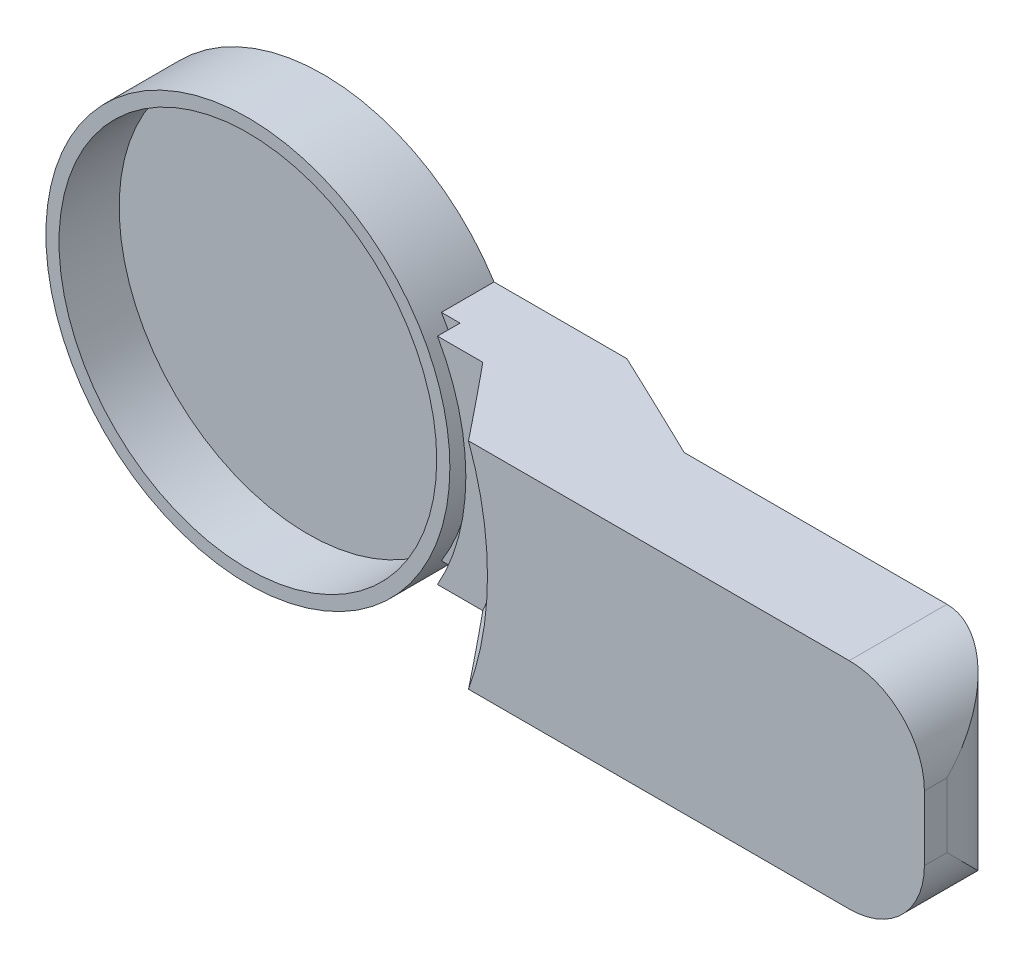
ISO-10303-21;
HEADER;
FILE_DESCRIPTION(('STEP AP214'),'2;1');
FILE_NAME('part.step','',(''),(''),'','','');
FILE_SCHEMA(('AUTOMOTIVE_DESIGN { 1 0 10303 214 1 1 1 1 }'));
ENDSEC;
DATA;
#1=APPLICATION_CONTEXT('core data for automotive mechanical design processes');
#2=APPLICATION_PROTOCOL_DEFINITION('international standard','automotive_design',2000,#1);
#3=PRODUCT_CONTEXT('',#1,'mechanical');
#4=PRODUCT('Part','Part','',(#3));
#5=PRODUCT_RELATED_PRODUCT_CATEGORY('part','',(#4));
#6=PRODUCT_DEFINITION_FORMATION('','',#4);
#7=PRODUCT_DEFINITION_CONTEXT('part definition',#1,'design');
#8=PRODUCT_DEFINITION('design','',#6,#7);
#9=PRODUCT_DEFINITION_SHAPE('','',#8);
#10=(LENGTH_UNIT() NAMED_UNIT(*) SI_UNIT(.MILLI.,.METRE.));
#11=(NAMED_UNIT(*) PLANE_ANGLE_UNIT() SI_UNIT($,.RADIAN.));
#12=(NAMED_UNIT(*) SI_UNIT($,.STERADIAN.) SOLID_ANGLE_UNIT());
#13=UNCERTAINTY_MEASURE_WITH_UNIT(LENGTH_MEASURE(1.E-05),#10,'distance_accuracy_value','');
#14=(GEOMETRIC_REPRESENTATION_CONTEXT(3) GLOBAL_UNCERTAINTY_ASSIGNED_CONTEXT((#13)) GLOBAL_UNIT_ASSIGNED_CONTEXT((#10,
#11,#12)) REPRESENTATION_CONTEXT('',''));
#15=CARTESIAN_POINT('',(0.,0.,0.));
#16=DIRECTION('',(0.,0.,1.));
#17=DIRECTION('',(1.,0.,0.));
#18=AXIS2_PLACEMENT_3D('',#15,#16,#17);
#19=CARTESIAN_POINT('',(0.,0.,10.));
#20=DIRECTION('',(0.,0.,1.));
#21=DIRECTION('',(1.,0.,0.));
#22=AXIS2_PLACEMENT_3D('',#19,#20,#21);
#23=PLANE('',#22);
#24=CARTESIAN_POINT('',(0.,0.,10.));
#25=DIRECTION('',(0.,0.,1.));
#26=DIRECTION('',(1.,0.,0.));
#27=AXIS2_PLACEMENT_3D('',#24,#25,#26);
#28=CIRCLE('',#27,25.125);
#29=CARTESIAN_POINT('',(25.125,0.,10.));
#30=VERTEX_POINT('',#29);
#31=EDGE_CURVE('E319',#30,#30,#28,.T.);
#32=ORIENTED_EDGE('',*,*,#31,.F.);
#33=EDGE_LOOP('',(#32));
#34=FACE_BOUND('',#33,.T.);
#35=CARTESIAN_POINT('',(0.,0.,10.));
#36=DIRECTION('',(0.,0.,1.));
#37=DIRECTION('',(1.,0.,0.));
#38=AXIS2_PLACEMENT_3D('',#35,#36,#37);
#39=CIRCLE('',#38,26.875);
#40=CARTESIAN_POINT('',(26.875,0.,10.));
#41=VERTEX_POINT('',#40);
#42=EDGE_CURVE('E263',#41,#41,#39,.T.);
#43=ORIENTED_EDGE('',*,*,#42,.T.);
#44=EDGE_LOOP('',(#43));
#45=FACE_BOUND('',#44,.T.);
#46=ADVANCED_FACE('F40',(#34,#45),#23,.T.);
#47=CARTESIAN_POINT('',(0.,0.,2.));
#48=DIRECTION('',(0.,0.,-1.));
#49=DIRECTION('',(-1.,0.,0.));
#50=AXIS2_PLACEMENT_3D('',#47,#48,#49);
#51=CYLINDRICAL_SURFACE('',#50,26.875);
#52=CARTESIAN_POINT('',(0.,0.,7.));
#53=DIRECTION('',(0.,0.,1.));
#54=DIRECTION('',(1.,0.,0.));
#55=AXIS2_PLACEMENT_3D('',#52,#53,#54);
#56=CIRCLE('',#55,26.875);
#57=CARTESIAN_POINT('',(22.7484191830579,-14.3099633008573,7.));
#58=VERTEX_POINT('',#57);
#59=CARTESIAN_POINT('',(22.7484191830579,14.3099633008573,7.));
#60=VERTEX_POINT('',#59);
#61=EDGE_CURVE('E143',#58,#60,#56,.T.);
#62=ORIENTED_EDGE('',*,*,#61,.T.);
#63=DIRECTION('',(0.,0.,1.));
#64=VECTOR('',#63,1.);
#65=CARTESIAN_POINT('',(22.7484191830579,14.3099633008573,7.));
#66=LINE('',#65,#64);
#67=CARTESIAN_POINT('',(22.7484191830579,14.3099633008573,0.));
#68=VERTEX_POINT('',#67);
#69=EDGE_CURVE('E314',#68,#60,#66,.T.);
#70=ORIENTED_EDGE('',*,*,#69,.F.);
#71=CARTESIAN_POINT('',(0.,0.,0.));
#72=DIRECTION('',(0.,0.,1.));
#73=DIRECTION('',(1.,0.,0.));
#74=AXIS2_PLACEMENT_3D('',#71,#72,#73);
#75=CIRCLE('',#74,26.875);
#76=CARTESIAN_POINT('',(22.7484191830579,-14.3099633008573,0.));
#77=VERTEX_POINT('',#76);
#78=EDGE_CURVE('E257',#68,#77,#75,.T.);
#79=ORIENTED_EDGE('',*,*,#78,.T.);
#80=DIRECTION('',(0.,0.,1.));
#81=VECTOR('',#80,1.);
#82=CARTESIAN_POINT('',(22.7484191830579,-14.3099633008573,7.));
#83=LINE('',#82,#81);
#84=EDGE_CURVE('E316',#77,#58,#83,.T.);
#85=ORIENTED_EDGE('',*,*,#84,.T.);
#86=EDGE_LOOP('',(#62,#70,#79,#85));
#87=FACE_BOUND('',#86,.T.);
#88=ORIENTED_EDGE('',*,*,#42,.F.);
#89=EDGE_LOOP('',(#88));
#90=FACE_BOUND('',#89,.T.);
#91=ADVANCED_FACE('F220',(#87,#90),#51,.T.);
#92=CARTESIAN_POINT('',(0.,0.,0.));
#93=DIRECTION('',(0.,0.,1.));
#94=DIRECTION('',(1.,0.,0.));
#95=AXIS2_PLACEMENT_3D('',#92,#93,#94);
#96=PLANE('',#95);
#97=ORIENTED_EDGE('',*,*,#78,.F.);
#98=DIRECTION('',(1.,0.,0.));
#99=VECTOR('',#98,1.);
#100=CARTESIAN_POINT('',(100.,14.3099633008573,0.));
#101=LINE('',#100,#99);
#102=CARTESIAN_POINT('',(40.4164641616277,14.3099633008573,0.));
#103=VERTEX_POINT('',#102);
#104=EDGE_CURVE('E331',#68,#103,#101,.T.);
#105=ORIENTED_EDGE('',*,*,#104,.T.);
#106=CARTESIAN_POINT('',(0.,0.,0.));
#107=DIRECTION('',(0.,0.,1.));
#108=DIRECTION('',(1.,0.,0.));
#109=AXIS2_PLACEMENT_3D('',#106,#107,#108);
#110=CIRCLE('',#109,42.8750000000002);
#111=CARTESIAN_POINT('',(40.4164641616277,-14.3099633008573,0.));
#112=VERTEX_POINT('',#111);
#113=EDGE_CURVE('E174',#103,#112,#110,.F.);
#114=ORIENTED_EDGE('',*,*,#113,.T.);
#115=DIRECTION('',(-1.,0.,0.));
#116=VECTOR('',#115,1.);
#117=CARTESIAN_POINT('',(0.,-14.3099633008573,0.));
#118=LINE('',#117,#116);
#119=EDGE_CURVE('E327',#77,#112,#118,.F.);
#120=ORIENTED_EDGE('',*,*,#119,.F.);
#121=EDGE_LOOP('',(#97,#105,#114,#120));
#122=FACE_BOUND('',#121,.T.);
#123=ADVANCED_FACE('F226',(#122),#96,.F.);
#124=CARTESIAN_POINT('',(0.,0.,10.));
#125=DIRECTION('',(0.,0.,1.));
#126=DIRECTION('',(1.,0.,0.));
#127=AXIS2_PLACEMENT_3D('',#124,#125,#126);
#128=CIRCLE('',#127,29.);
#129=CARTESIAN_POINT('',(25.2234999619029,-14.3099633008573,10.));
#130=VERTEX_POINT('',#129);
#131=CARTESIAN_POINT('',(25.2234999619029,14.3099633008573,10.));
#132=VERTEX_POINT('',#131);
#133=EDGE_CURVE('E132',#130,#132,#128,.T.);
#134=ORIENTED_EDGE('',*,*,#133,.F.);
#135=DIRECTION('',(-1.,0.,0.));
#136=VECTOR('',#135,1.);
#137=CARTESIAN_POINT('',(0.,-14.3099633008573,10.));
#138=LINE('',#137,#136);
#139=CARTESIAN_POINT('',(31.2548488290717,-14.3099633008573,10.));
#140=VERTEX_POINT('',#139);
#141=EDGE_CURVE('E162',#140,#130,#138,.T.);
#142=ORIENTED_EDGE('',*,*,#141,.F.);
#143=CARTESIAN_POINT('',(0.,0.,10.));
#144=DIRECTION('',(0.,0.,1.));
#145=DIRECTION('',(1.,0.,0.));
#146=AXIS2_PLACEMENT_3D('',#143,#144,#145);
#147=CIRCLE('',#146,34.3750000000001);
#148=CARTESIAN_POINT('',(31.2548488290717,14.3099633008573,10.));
#149=VERTEX_POINT('',#148);
#150=EDGE_CURVE('E156',#140,#149,#147,.T.);
#151=ORIENTED_EDGE('',*,*,#150,.T.);
#152=DIRECTION('',(1.,0.,0.));
#153=VECTOR('',#152,1.);
#154=CARTESIAN_POINT('',(100.,14.3099633008573,10.));
#155=LINE('',#154,#153);
#156=EDGE_CURVE('E148',#132,#149,#155,.T.);
#157=ORIENTED_EDGE('',*,*,#156,.F.);
#158=EDGE_LOOP('',(#134,#142,#151,#157));
#159=FACE_BOUND('',#158,.T.);
#160=ADVANCED_FACE('F154',(#159),#23,.T.);
#161=CARTESIAN_POINT('',(0.,0.,10.));
#162=DIRECTION('',(0.,0.,-1.));
#163=DIRECTION('',(-1.,0.,0.));
#164=AXIS2_PLACEMENT_3D('',#161,#162,#163);
#165=CYLINDRICAL_SURFACE('',#164,25.125);
#166=ORIENTED_EDGE('',*,*,#31,.T.);
#167=EDGE_LOOP('',(#166));
#168=FACE_BOUND('',#167,.T.);
#169=CARTESIAN_POINT('',(0.,0.,2.));
#170=DIRECTION('',(0.,0.,1.));
#171=DIRECTION('',(1.,0.,0.));
#172=AXIS2_PLACEMENT_3D('',#169,#170,#171);
#173=CIRCLE('',#172,25.125);
#174=CARTESIAN_POINT('',(25.125,0.,2.));
#175=VERTEX_POINT('',#174);
#176=EDGE_CURVE('E254',#175,#175,#173,.F.);
#177=ORIENTED_EDGE('',*,*,#176,.T.);
#178=EDGE_LOOP('',(#177));
#179=FACE_BOUND('',#178,.T.);
#180=ADVANCED_FACE('F233',(#168,#179),#165,.F.);
#181=CARTESIAN_POINT('',(0.,0.,2.));
#182=DIRECTION('',(0.,0.,1.));
#183=DIRECTION('',(1.,0.,0.));
#184=AXIS2_PLACEMENT_3D('',#181,#182,#183);
#185=PLANE('',#184);
#186=ORIENTED_EDGE('',*,*,#176,.F.);
#187=EDGE_LOOP('',(#186));
#188=FACE_BOUND('',#187,.T.);
#189=ADVANCED_FACE('F238',(#188),#185,.T.);
#190=CARTESIAN_POINT('',(100.,14.3099633008573,7.));
#191=DIRECTION('',(-1.,0.,0.));
#192=DIRECTION('',(0.,0.,1.));
#193=AXIS2_PLACEMENT_3D('',#190,#191,#192);
#194=PLANE('',#193);
#195=DIRECTION('',(0.,-1.,0.));
#196=VECTOR('',#195,1.);
#197=CARTESIAN_POINT('',(100.,14.3099633008573,20.));
#198=LINE('',#197,#196);
#199=CARTESIAN_POINT('',(100.,4.30996330085727,20.));
#200=VERTEX_POINT('',#199);
#201=CARTESIAN_POINT('',(100.,-4.30996330085727,20.));
#202=VERTEX_POINT('',#201);
#203=EDGE_CURVE('E304',#200,#202,#198,.T.);
#204=ORIENTED_EDGE('',*,*,#203,.T.);
#205=DIRECTION('',(0.,0.,1.));
#206=VECTOR('',#205,1.);
#207=CARTESIAN_POINT('',(100.,-4.30996330085727,7.));
#208=LINE('',#207,#206);
#209=CARTESIAN_POINT('',(100.,-4.30996330085727,17.));
#210=VERTEX_POINT('',#209);
#211=EDGE_CURVE('E298',#202,#210,#208,.F.);
#212=ORIENTED_EDGE('',*,*,#211,.T.);
#213=DIRECTION('',(0.,-1.,0.));
#214=VECTOR('',#213,1.);
#215=CARTESIAN_POINT('',(100.,14.3099633008573,17.));
#216=LINE('',#215,#214);
#217=CARTESIAN_POINT('',(100.,4.30996330085727,17.));
#218=VERTEX_POINT('',#217);
#219=EDGE_CURVE('E293',#210,#218,#216,.F.);
#220=ORIENTED_EDGE('',*,*,#219,.T.);
#221=DIRECTION('',(0.,0.,1.));
#222=VECTOR('',#221,1.);
#223=CARTESIAN_POINT('',(100.,4.30996330085727,20.));
#224=LINE('',#223,#222);
#225=EDGE_CURVE('E286',#218,#200,#224,.T.);
#226=ORIENTED_EDGE('',*,*,#225,.T.);
#227=EDGE_LOOP('',(#204,#212,#220,#226));
#228=FACE_BOUND('',#227,.T.);
#229=ADVANCED_FACE('F246',(#228),#194,.F.);
#230=CARTESIAN_POINT('',(100.,-14.3099633008573,7.));
#231=DIRECTION('',(0.,1.,0.));
#232=DIRECTION('',(-1.,0.,0.));
#233=AXIS2_PLACEMENT_3D('',#230,#231,#232);
#234=PLANE('',#233);
#235=DIRECTION('',(-1.,0.,0.));
#236=VECTOR('',#235,1.);
#237=CARTESIAN_POINT('',(100.,-14.3099633008573,7.));
#238=LINE('',#237,#236);
#239=CARTESIAN_POINT('',(90.,-14.3099633008573,7.));
#240=VERTEX_POINT('',#239);
#241=CARTESIAN_POINT('',(55.0453501699111,-14.3099633008573,7.));
#242=VERTEX_POINT('',#241);
#243=EDGE_CURVE('E280',#240,#242,#238,.T.);
#244=ORIENTED_EDGE('',*,*,#243,.F.);
#245=DIRECTION('',(0.,0.,1.));
#246=VECTOR('',#245,1.);
#247=CARTESIAN_POINT('',(90.,-14.3099633008573,7.));
#248=LINE('',#247,#246);
#249=CARTESIAN_POINT('',(90.,-14.3099633008573,20.));
#250=VERTEX_POINT('',#249);
#251=EDGE_CURVE('E65',#240,#250,#248,.T.);
#252=ORIENTED_EDGE('',*,*,#251,.T.);
#253=DIRECTION('',(-1.,0.,0.));
#254=VECTOR('',#253,1.);
#255=CARTESIAN_POINT('',(100.,-14.3099633008573,20.));
#256=LINE('',#255,#254);
#257=CARTESIAN_POINT('',(39.3540414103574,-14.3099633008573,20.));
#258=VERTEX_POINT('',#257);
#259=EDGE_CURVE('E274',#250,#258,#256,.T.);
#260=ORIENTED_EDGE('',*,*,#259,.T.);
#261=CARTESIAN_POINT('',(39.3540414103574,-14.3099633008573,20.));
#262=CARTESIAN_POINT('',(38.918200396022,-14.3099633008573,19.4538669715759));
#263=CARTESIAN_POINT('',(38.4818466587863,-14.3099633008573,18.9081430980953));
#264=CARTESIAN_POINT('',(37.6080013020913,-14.3099633008573,17.8176062175523));
#265=CARTESIAN_POINT('',(37.1705096813851,-14.3099633008573,17.2727932114891));
#266=CARTESIAN_POINT('',(35.8561915050751,-14.3099633008573,15.6398993044532));
#267=CARTESIAN_POINT('',(34.9774910794101,-14.3099633008573,14.553325193687));
#268=CARTESIAN_POINT('',(33.2139466652834,-14.3099633008573,12.3851455345182));
#269=CARTESIAN_POINT('',(32.3291025995349,-14.3099633008573,11.3035400489064));
#270=CARTESIAN_POINT('',(30.9960731395238,-14.3099633008573,9.68585046843278));
#271=CARTESIAN_POINT('',(30.5507617427346,-14.3099633008573,9.14739785954175));
#272=CARTESIAN_POINT('',(29.6579675153371,-14.3099633008573,8.07229265777268));
#273=CARTESIAN_POINT('',(29.2104846763867,-14.3099633008573,7.53564007182324));
#274=CARTESIAN_POINT('',(28.7617901968588,-14.3099633008573,7.));
#275=B_SPLINE_CURVE_WITH_KNOTS('',3,(#261,#262,#263,#264,#265,#266,#267,#268,#269,#270,#271,
#272,#273,#274),.UNSPECIFIED.,.F.,.F.,(4,2,2,2,2,2,4),(0.,2.09617895840916,4.19236021476433,
8.38457569338143,12.5768440058506,14.6730500323726,16.7692641183333),.UNSPECIFIED.);
#276=EDGE_CURVE('E260',#258,#140,#275,.T.);
#277=ORIENTED_EDGE('',*,*,#276,.T.);
#278=ORIENTED_EDGE('',*,*,#141,.T.);
#279=DIRECTION('',(0.,0.,1.));
#280=VECTOR('',#279,1.);
#281=CARTESIAN_POINT('',(25.2234999619029,-14.3099633008573,7.));
#282=LINE('',#281,#280);
#283=CARTESIAN_POINT('',(25.2234999619029,-14.3099633008573,7.));
#284=VERTEX_POINT('',#283);
#285=EDGE_CURVE('E139',#130,#284,#282,.F.);
#286=ORIENTED_EDGE('',*,*,#285,.T.);
#287=DIRECTION('',(1.,0.,0.));
#288=VECTOR('',#287,1.);
#289=CARTESIAN_POINT('',(100.,-14.3099633008573,7.));
#290=LINE('',#289,#288);
#291=EDGE_CURVE('E308',#58,#284,#290,.T.);
#292=ORIENTED_EDGE('',*,*,#291,.F.);
#293=ORIENTED_EDGE('',*,*,#84,.F.);
#294=ORIENTED_EDGE('',*,*,#119,.T.);
#295=CARTESIAN_POINT('',(22.7484191830579,-14.3099633008573,-8.00000000000021));
#296=CARTESIAN_POINT('',(23.2931688216632,-14.3099633008573,-7.76942524856581));
#297=CARTESIAN_POINT('',(23.8370881150449,-14.3099633008573,-7.5368988022653));
#298=CARTESIAN_POINT('',(24.9234588988973,-14.3099633008573,-7.0684569490064));
#299=CARTESIAN_POINT('',(25.4659104054992,-14.3099633008573,-6.83254157947434));
#300=CARTESIAN_POINT('',(26.549527642955,-14.3099633008573,-6.35784121796449));
#301=CARTESIAN_POINT('',(27.0906934271248,-14.3099633008573,-6.11905634755649));
#302=CARTESIAN_POINT('',(28.1719220644972,-14.3099633008573,-5.63899943525557));
#303=CARTESIAN_POINT('',(28.7119849141987,-14.3099633008573,-5.39772738548191));
#304=CARTESIAN_POINT('',(30.330619238033,-14.3099633008573,-4.6707471362914));
#305=CARTESIAN_POINT('',(31.4077478829394,-14.3099633008573,-4.18182586477596));
#306=CARTESIAN_POINT('',(33.5590309628089,-14.3099633008573,-3.19746118184968));
#307=CARTESIAN_POINT('',(34.6331853600071,-14.3099633008573,-2.70201768807957));
#308=CARTESIAN_POINT('',(36.7789779052465,-14.3099633008573,-1.70612235140349));
#309=CARTESIAN_POINT('',(37.8506163972555,-14.3099633008573,-1.20567124908914));
#310=CARTESIAN_POINT('',(39.9919989156063,-14.3099633008573,-0.200747398782866));
#311=CARTESIAN_POINT('',(41.0617429500997,-14.3099633008573,0.303725331852886));
#312=CARTESIAN_POINT('',(43.1997217386016,-14.3099633008573,1.31592218272281));
#313=CARTESIAN_POINT('',(44.267956456428,-14.3099633008573,1.82364637934094));
#314=CARTESIAN_POINT('',(46.4031658905237,-14.3099633008573,2.84173810149619));
#315=CARTESIAN_POINT('',(47.47014060601,-14.3099633008573,3.3521056286749));
#316=CARTESIAN_POINT('',(49.079465590941,-14.3099633008573,4.12392359823363));
#317=CARTESIAN_POINT('',(49.6222043222016,-14.3099633008573,4.38456456231667));
#318=CARTESIAN_POINT('',(50.7074296415187,-14.3099633008573,4.90636217626705));
#319=CARTESIAN_POINT('',(51.2499162311441,-14.3099633008573,5.16751882287138));
#320=CARTESIAN_POINT('',(52.3346795169204,-14.3099633008573,5.69031256158583));
#321=CARTESIAN_POINT('',(52.8769562056906,-14.3099633008573,5.95194966900833));
#322=CARTESIAN_POINT('',(53.9613038124597,-14.3099633008573,6.47565877397902));
#323=CARTESIAN_POINT('',(54.5033747291247,-14.3099633008573,6.73773077428893));
#324=CARTESIAN_POINT('',(55.0453501699111,-14.3099633008573,7.));
#325=B_SPLINE_CURVE_WITH_KNOTS('',3,(#295,#296,#297,#298,#299,#300,#301,#302,#303,#304,#305,
#306,#307,#308,#309,#310,#311,#312,#313,#314,#315,#316,#317,#318,#319,#320,#321,#322,#323,#324),
.UNSPECIFIED.,.F.,.F.,(4,2,2,2,2,2,2,2,2,2,2,2,2,2,4),(0.,1.77460369200208,3.54918780082176,
5.32369699049992,7.09821180451367,10.6468763877609,14.1955858247862,17.7437779685368,
21.2919548076021,24.8402153090328,28.3884780143063,30.1947146021795,32.0009397973675,
33.8072235925301,35.6135189024584),.UNSPECIFIED.);
#326=EDGE_CURVE('E176',#112,#242,#325,.T.);
#327=ORIENTED_EDGE('',*,*,#326,.T.);
#328=EDGE_LOOP('',(#244,#252,#260,#277,#278,#286,#292,#293,#294,#327));
#329=FACE_BOUND('',#328,.T.);
#330=ADVANCED_FACE('F191',(#329),#234,.F.);
#331=CARTESIAN_POINT('',(100.,14.3099633008573,7.));
#332=DIRECTION('',(0.,1.,0.));
#333=DIRECTION('',(-1.,0.,0.));
#334=AXIS2_PLACEMENT_3D('',#331,#332,#333);
#335=PLANE('',#334);
#336=DIRECTION('',(-1.,0.,0.));
#337=VECTOR('',#336,1.);
#338=CARTESIAN_POINT('',(100.,14.3099633008573,20.));
#339=LINE('',#338,#337);
#340=CARTESIAN_POINT('',(90.,14.3099633008573,20.));
#341=VERTEX_POINT('',#340);
#342=CARTESIAN_POINT('',(39.3540414103574,14.3099633008573,20.));
#343=VERTEX_POINT('',#342);
#344=EDGE_CURVE('E277',#341,#343,#339,.T.);
#345=ORIENTED_EDGE('',*,*,#344,.F.);
#346=DIRECTION('',(0.,0.,1.));
#347=VECTOR('',#346,1.);
#348=CARTESIAN_POINT('',(90.,14.3099633008573,7.));
#349=LINE('',#348,#347);
#350=CARTESIAN_POINT('',(90.,14.3099633008573,7.));
#351=VERTEX_POINT('',#350);
#352=EDGE_CURVE('E11',#341,#351,#349,.F.);
#353=ORIENTED_EDGE('',*,*,#352,.T.);
#354=DIRECTION('',(-1.,0.,0.));
#355=VECTOR('',#354,1.);
#356=CARTESIAN_POINT('',(100.,14.3099633008573,7.));
#357=LINE('',#356,#355);
#358=CARTESIAN_POINT('',(55.0453501699111,14.3099633008573,7.));
#359=VERTEX_POINT('',#358);
#360=EDGE_CURVE('E311',#351,#359,#357,.T.);
#361=ORIENTED_EDGE('',*,*,#360,.T.);
#362=CARTESIAN_POINT('',(55.0453501699111,14.3099633008573,7.));
#363=CARTESIAN_POINT('',(53.7096242638324,14.3099633008573,6.35366469664284));
#364=CARTESIAN_POINT('',(52.373344674416,14.3099633008573,5.7084693043036));
#365=CARTESIAN_POINT('',(49.6993404675902,14.3099633008573,4.42109005335672));
#366=CARTESIAN_POINT('',(48.3616158541539,14.3099633008573,3.77890618649449));
#367=CARTESIAN_POINT('',(45.6845406500232,14.3099633008573,2.49835660927061));
#368=CARTESIAN_POINT('',(44.3451902786643,14.3099633008573,1.8599904406735));
#369=CARTESIAN_POINT('',(41.6641986291977,14.3099633008573,0.588058825084401));
#370=CARTESIAN_POINT('',(40.3225573353683,14.3099633008573,-0.0455065887983184));
#371=CARTESIAN_POINT('',(37.6361495167242,14.3099633008573,-1.30642701218183));
#372=CARTESIAN_POINT('',(36.2913826170486,14.3099633008573,-1.93378122366719));
#373=CARTESIAN_POINT('',(33.5979667249995,14.3099633008573,-3.18005701546444));
#374=CARTESIAN_POINT('',(32.2493178038109,14.3099633008573,-3.79897874922513));
#375=CARTESIAN_POINT('',(30.2222792758602,14.3099633008573,-4.71863941247906));
#376=CARTESIAN_POINT('',(29.5458773880585,14.3099633008573,-5.0237591949897));
#377=CARTESIAN_POINT('',(28.1915071843088,14.3099633008573,-5.63049525208812));
#378=CARTESIAN_POINT('',(27.5135388765634,14.3099633008573,-5.93211154497256));
#379=CARTESIAN_POINT('',(26.1557117746274,14.3099633008573,-6.531177453783));
#380=CARTESIAN_POINT('',(25.4758528685187,14.3099633008573,-6.82862681646225));
#381=CARTESIAN_POINT('',(24.1139012875217,14.3099633008573,-7.41839772250544));
#382=CARTESIAN_POINT('',(23.4318085724073,14.3099633008573,-7.71071917291734));
#383=CARTESIAN_POINT('',(22.7484191830579,14.3099633008573,-8.00000000000021));
#384=B_SPLINE_CURVE_WITH_KNOTS('',3,(#362,#363,#364,#365,#366,#367,#368,#369,#370,#371,#372,
#373,#374,#375,#376,#377,#378,#379,#380,#381,#382,#383),.UNSPECIFIED.,.F.,.F.,(4,2,2,2,2,2,2,2,
2,2,4),(0.,4.45165561746435,8.90329902580481,13.3543969277941,17.8055254996947,22.2572187189001,
26.7088308205643,28.9349312441426,31.1610200368949,33.3872435391721,35.6135073538883),.UNSPECIFIED.);
#385=EDGE_CURVE('E185',#359,#103,#384,.T.);
#386=ORIENTED_EDGE('',*,*,#385,.T.);
#387=ORIENTED_EDGE('',*,*,#104,.F.);
#388=ORIENTED_EDGE('',*,*,#69,.T.);
#389=DIRECTION('',(1.,0.,0.));
#390=VECTOR('',#389,1.);
#391=CARTESIAN_POINT('',(100.,14.3099633008573,7.));
#392=LINE('',#391,#390);
#393=CARTESIAN_POINT('',(25.2234999619029,14.3099633008573,7.));
#394=VERTEX_POINT('',#393);
#395=EDGE_CURVE('E151',#60,#394,#392,.T.);
#396=ORIENTED_EDGE('',*,*,#395,.T.);
#397=DIRECTION('',(0.,0.,1.));
#398=VECTOR('',#397,1.);
#399=CARTESIAN_POINT('',(25.2234999619029,14.3099633008573,7.));
#400=LINE('',#399,#398);
#401=EDGE_CURVE('E136',#132,#394,#400,.F.);
#402=ORIENTED_EDGE('',*,*,#401,.F.);
#403=ORIENTED_EDGE('',*,*,#156,.T.);
#404=CARTESIAN_POINT('',(28.7617901968588,14.3099633008573,7.));
#405=CARTESIAN_POINT('',(29.2104846763867,14.3099633008573,7.53564007182325));
#406=CARTESIAN_POINT('',(29.6579675153371,14.3099633008573,8.07229265777268));
#407=CARTESIAN_POINT('',(30.5507617427346,14.3099633008573,9.14739785954175));
#408=CARTESIAN_POINT('',(30.9960731395238,14.3099633008573,9.68585046843278));
#409=CARTESIAN_POINT('',(32.3291025995349,14.3099633008573,11.3035400489064));
#410=CARTESIAN_POINT('',(33.2139466652834,14.3099633008573,12.3851455345182));
#411=CARTESIAN_POINT('',(34.9774910794101,14.3099633008573,14.553325193687));
#412=CARTESIAN_POINT('',(35.8561915050751,14.3099633008573,15.6398993044532));
#413=CARTESIAN_POINT('',(37.1705096813851,14.3099633008573,17.2727932114891));
#414=CARTESIAN_POINT('',(37.6080013020913,14.3099633008573,17.8176062175523));
#415=CARTESIAN_POINT('',(38.4818466587863,14.3099633008573,18.9081430980953));
#416=CARTESIAN_POINT('',(38.918200396022,14.3099633008573,19.4538669715759));
#417=CARTESIAN_POINT('',(39.3540414103574,14.3099633008573,20.));
#418=B_SPLINE_CURVE_WITH_KNOTS('',3,(#404,#405,#406,#407,#408,#409,#410,#411,#412,#413,#414,
#415,#416,#417),.UNSPECIFIED.,.F.,.F.,(4,2,2,2,2,2,4),(0.,2.09621408596067,4.19242011248273,
8.38468842495186,12.576903903569,14.6730851599241,16.7692641183333),.UNSPECIFIED.);
#419=EDGE_CURVE('E158',#149,#343,#418,.T.);
#420=ORIENTED_EDGE('',*,*,#419,.T.);
#421=EDGE_LOOP('',(#345,#353,#361,#386,#387,#388,#396,#402,#403,#420));
#422=FACE_BOUND('',#421,.T.);
#423=ADVANCED_FACE('F146',(#422),#335,.T.);
#424=CARTESIAN_POINT('',(0.,0.,7.));
#425=DIRECTION('',(0.,0.,-1.));
#426=DIRECTION('',(-1.,0.,0.));
#427=AXIS2_PLACEMENT_3D('',#424,#425,#426);
#428=PLANE('',#427);
#429=ORIENTED_EDGE('',*,*,#360,.F.);
#430=DIRECTION('',(0.,-1.,0.));
#431=VECTOR('',#430,1.);
#432=CARTESIAN_POINT('',(90.,-14.3099633008573,7.));
#433=LINE('',#432,#431);
#434=EDGE_CURVE('E152',#351,#240,#433,.T.);
#435=ORIENTED_EDGE('',*,*,#434,.T.);
#436=ORIENTED_EDGE('',*,*,#243,.T.);
#437=CARTESIAN_POINT('',(0.,0.,7.));
#438=DIRECTION('',(0.,0.,-1.));
#439=DIRECTION('',(-1.,0.,0.));
#440=AXIS2_PLACEMENT_3D('',#437,#438,#439);
#441=CIRCLE('',#440,56.8750000000001);
#442=EDGE_CURVE('E160',#242,#359,#441,.F.);
#443=ORIENTED_EDGE('',*,*,#442,.T.);
#444=EDGE_LOOP('',(#429,#435,#436,#443));
#445=FACE_BOUND('',#444,.T.);
#446=ADVANCED_FACE('F336',(#445),#428,.T.);
#447=CARTESIAN_POINT('',(0.,0.,20.));
#448=DIRECTION('',(0.,0.,-1.));
#449=DIRECTION('',(-1.,0.,0.));
#450=AXIS2_PLACEMENT_3D('',#447,#448,#449);
#451=PLANE('',#450);
#452=ORIENTED_EDGE('',*,*,#259,.F.);
#453=CARTESIAN_POINT('',(90.,-4.30996330085727,20.));
#454=DIRECTION('',(0.,0.,-1.));
#455=DIRECTION('',(-1.,0.,0.));
#456=AXIS2_PLACEMENT_3D('',#453,#454,#455);
#457=CIRCLE('',#456,10.);
#458=EDGE_CURVE('E49',#250,#202,#457,.F.);
#459=ORIENTED_EDGE('',*,*,#458,.T.);
#460=ORIENTED_EDGE('',*,*,#203,.F.);
#461=CARTESIAN_POINT('',(90.,4.30996330085727,20.));
#462=DIRECTION('',(0.,0.,-1.));
#463=DIRECTION('',(-1.,0.,0.));
#464=AXIS2_PLACEMENT_3D('',#461,#462,#463);
#465=CIRCLE('',#464,10.);
#466=EDGE_CURVE('E57',#200,#341,#465,.F.);
#467=ORIENTED_EDGE('',*,*,#466,.T.);
#468=ORIENTED_EDGE('',*,*,#344,.T.);
#469=CARTESIAN_POINT('',(0.,0.,20.));
#470=DIRECTION('',(0.,0.,-1.));
#471=DIRECTION('',(-1.,0.,0.));
#472=AXIS2_PLACEMENT_3D('',#469,#470,#471);
#473=CIRCLE('',#472,41.8750000000002);
#474=EDGE_CURVE('E256',#343,#258,#473,.T.);
#475=ORIENTED_EDGE('',*,*,#474,.T.);
#476=EDGE_LOOP('',(#452,#459,#460,#467,#468,#475));
#477=FACE_BOUND('',#476,.T.);
#478=ADVANCED_FACE('F303',(#477),#451,.F.);
#479=CARTESIAN_POINT('',(0.,0.,20.));
#480=DIRECTION('',(0.,0.,1.));
#481=DIRECTION('',(1.,0.,0.));
#482=AXIS2_PLACEMENT_3D('',#479,#480,#481);
#483=CONICAL_SURFACE('',#482,41.8750000000002,0.643501108793286);
#484=ORIENTED_EDGE('',*,*,#419,.F.);
#485=ORIENTED_EDGE('',*,*,#150,.F.);
#486=ORIENTED_EDGE('',*,*,#276,.F.);
#487=ORIENTED_EDGE('',*,*,#474,.F.);
#488=EDGE_LOOP('',(#484,#485,#486,#487));
#489=FACE_BOUND('',#488,.T.);
#490=ADVANCED_FACE('F202',(#489),#483,.F.);
#491=CARTESIAN_POINT('',(0.,0.,-8.00000000000021));
#492=DIRECTION('',(0.,0.,1.));
#493=DIRECTION('',(1.,0.,0.));
#494=AXIS2_PLACEMENT_3D('',#491,#492,#493);
#495=CONICAL_SURFACE('',#494,26.875,1.10714871779409);
#496=ORIENTED_EDGE('',*,*,#385,.F.);
#497=ORIENTED_EDGE('',*,*,#442,.F.);
#498=ORIENTED_EDGE('',*,*,#326,.F.);
#499=ORIENTED_EDGE('',*,*,#113,.F.);
#500=EDGE_LOOP('',(#496,#497,#498,#499));
#501=FACE_BOUND('',#500,.T.);
#502=ADVANCED_FACE('F195',(#501),#495,.T.);
#503=CARTESIAN_POINT('',(0.,0.,7.));
#504=DIRECTION('',(0.,0.,1.));
#505=DIRECTION('',(1.,0.,0.));
#506=AXIS2_PLACEMENT_3D('',#503,#504,#505);
#507=CYLINDRICAL_SURFACE('',#506,29.);
#508=ORIENTED_EDGE('',*,*,#133,.T.);
#509=ORIENTED_EDGE('',*,*,#401,.T.);
#510=CARTESIAN_POINT('',(0.,0.,7.));
#511=DIRECTION('',(0.,0.,1.));
#512=DIRECTION('',(1.,0.,0.));
#513=AXIS2_PLACEMENT_3D('',#510,#511,#512);
#514=CIRCLE('',#513,29.);
#515=EDGE_CURVE('E338',#284,#394,#514,.T.);
#516=ORIENTED_EDGE('',*,*,#515,.F.);
#517=ORIENTED_EDGE('',*,*,#285,.F.);
#518=EDGE_LOOP('',(#508,#509,#516,#517));
#519=FACE_BOUND('',#518,.T.);
#520=ADVANCED_FACE('F134',(#519),#507,.F.);
#521=CARTESIAN_POINT('',(0.,0.,7.));
#522=DIRECTION('',(0.,0.,1.));
#523=DIRECTION('',(1.,0.,0.));
#524=AXIS2_PLACEMENT_3D('',#521,#522,#523);
#525=PLANE('',#524);
#526=ORIENTED_EDGE('',*,*,#291,.T.);
#527=ORIENTED_EDGE('',*,*,#515,.T.);
#528=ORIENTED_EDGE('',*,*,#395,.F.);
#529=ORIENTED_EDGE('',*,*,#61,.F.);
#530=EDGE_LOOP('',(#526,#527,#528,#529));
#531=FACE_BOUND('',#530,.T.);
#532=ADVANCED_FACE('F216',(#531),#525,.T.);
#533=CARTESIAN_POINT('',(90.,4.30996330085727,7.));
#534=DIRECTION('',(0.,0.,-1.));
#535=DIRECTION('',(-1.,0.,0.));
#536=AXIS2_PLACEMENT_3D('',#533,#534,#535);
#537=CYLINDRICAL_SURFACE('',#536,10.);
#538=ORIENTED_EDGE('',*,*,#466,.F.);
#539=ORIENTED_EDGE('',*,*,#225,.F.);
#540=CARTESIAN_POINT('',(90.,4.30996330085727,17.));
#541=DIRECTION('',(0.,-0.707106781186547,-0.707106781186547));
#542=DIRECTION('',(0.,0.707106781186547,-0.707106781186547));
#543=AXIS2_PLACEMENT_3D('',#540,#541,#542);
#544=ELLIPSE('',#543,14.1421356237309,10.);
#545=EDGE_CURVE('E44',#351,#218,#544,.T.);
#546=ORIENTED_EDGE('',*,*,#545,.F.);
#547=ORIENTED_EDGE('',*,*,#352,.F.);
#548=EDGE_LOOP('',(#538,#539,#546,#547));
#549=FACE_BOUND('',#548,.T.);
#550=ADVANCED_FACE('F42',(#549),#537,.T.);
#551=CARTESIAN_POINT('',(90.,-4.30996330085727,7.));
#552=DIRECTION('',(0.,0.,1.));
#553=DIRECTION('',(1.,0.,0.));
#554=AXIS2_PLACEMENT_3D('',#551,#552,#553);
#555=CYLINDRICAL_SURFACE('',#554,10.);
#556=ORIENTED_EDGE('',*,*,#458,.F.);
#557=ORIENTED_EDGE('',*,*,#251,.F.);
#558=CARTESIAN_POINT('',(90.,-4.30996330085727,17.));
#559=DIRECTION('',(0.,-0.707106781186547,0.707106781186547));
#560=DIRECTION('',(0.,0.707106781186547,0.707106781186547));
#561=AXIS2_PLACEMENT_3D('',#558,#559,#560);
#562=ELLIPSE('',#561,14.1421356237309,10.);
#563=EDGE_CURVE('E288',#210,#240,#562,.F.);
#564=ORIENTED_EDGE('',*,*,#563,.F.);
#565=ORIENTED_EDGE('',*,*,#211,.F.);
#566=EDGE_LOOP('',(#556,#557,#564,#565));
#567=FACE_BOUND('',#566,.T.);
#568=ADVANCED_FACE('F209',(#567),#555,.T.);
#569=CARTESIAN_POINT('',(90.,0.,17.));
#570=DIRECTION('',(0.,1.,0.));
#571=DIRECTION('',(0.,0.,1.));
#572=AXIS2_PLACEMENT_3D('',#569,#570,#571);
#573=CYLINDRICAL_SURFACE('',#572,10.);
#574=ORIENTED_EDGE('',*,*,#545,.T.);
#575=ORIENTED_EDGE('',*,*,#219,.F.);
#576=ORIENTED_EDGE('',*,*,#563,.T.);
#577=ORIENTED_EDGE('',*,*,#434,.F.);
#578=EDGE_LOOP('',(#574,#575,#576,#577));
#579=FACE_BOUND('',#578,.T.);
#580=ADVANCED_FACE('F206',(#579),#573,.T.);
#581=CLOSED_SHELL('',(#46,#91,#123,#160,#180,#189,#229,#330,#423,#446,#478,#490,#502,#520,#532,
#550,#568,#580));
#582=MANIFOLD_SOLID_BREP('B2',#581);
#583=ADVANCED_BREP_SHAPE_REPRESENTATION('',(#18,#582),#14);
#584=SHAPE_DEFINITION_REPRESENTATION(#9,#583);
ENDSEC;
END-ISO-10303-21;
